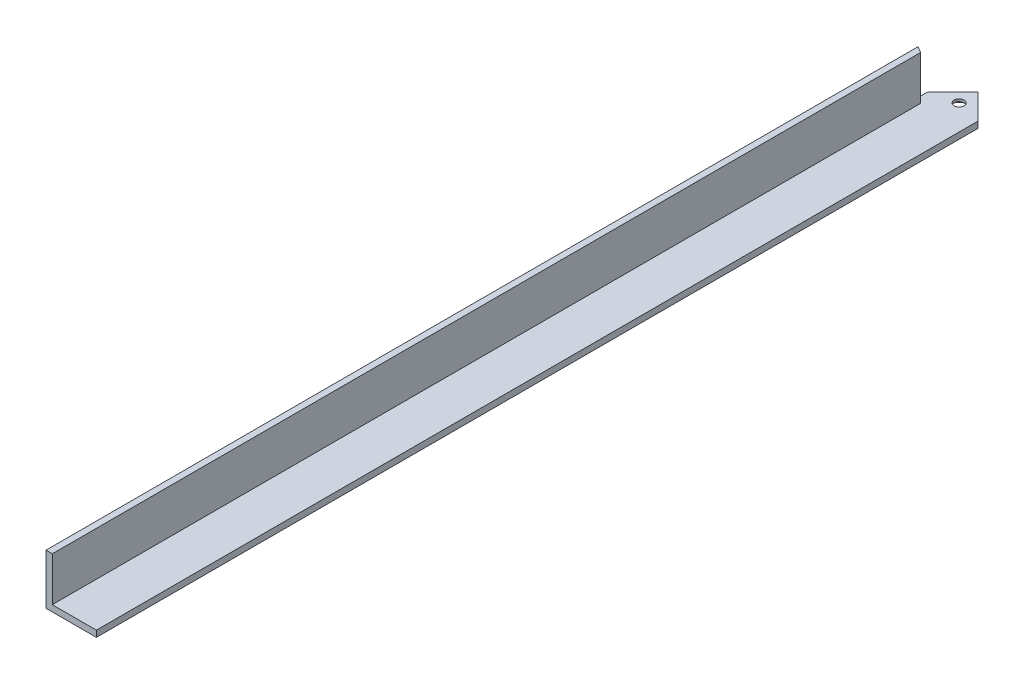
ISO-10303-21;
HEADER;
FILE_DESCRIPTION(('STEP AP214'),'2;1');
FILE_NAME('part.step','',(''),(''),'','','');
FILE_SCHEMA(('AUTOMOTIVE_DESIGN { 1 0 10303 214 1 1 1 1 }'));
ENDSEC;
DATA;
#1=APPLICATION_CONTEXT('core data for automotive mechanical design processes');
#2=APPLICATION_PROTOCOL_DEFINITION('international standard','automotive_design',2000,#1);
#3=PRODUCT_CONTEXT('',#1,'mechanical');
#4=PRODUCT('Part','Part','',(#3));
#5=PRODUCT_RELATED_PRODUCT_CATEGORY('part','',(#4));
#6=PRODUCT_DEFINITION_FORMATION('','',#4);
#7=PRODUCT_DEFINITION_CONTEXT('part definition',#1,'design');
#8=PRODUCT_DEFINITION('design','',#6,#7);
#9=PRODUCT_DEFINITION_SHAPE('','',#8);
#10=(LENGTH_UNIT() NAMED_UNIT(*) SI_UNIT(.MILLI.,.METRE.));
#11=(NAMED_UNIT(*) PLANE_ANGLE_UNIT() SI_UNIT($,.RADIAN.));
#12=(NAMED_UNIT(*) SI_UNIT($,.STERADIAN.) SOLID_ANGLE_UNIT());
#13=UNCERTAINTY_MEASURE_WITH_UNIT(LENGTH_MEASURE(1.E-05),#10,'distance_accuracy_value','');
#14=(GEOMETRIC_REPRESENTATION_CONTEXT(3) GLOBAL_UNCERTAINTY_ASSIGNED_CONTEXT((#13)) GLOBAL_UNIT_ASSIGNED_CONTEXT((#10,
#11,#12)) REPRESENTATION_CONTEXT('',''));
#15=CARTESIAN_POINT('',(0.,0.,0.));
#16=DIRECTION('',(0.,0.,1.));
#17=DIRECTION('',(1.,0.,0.));
#18=AXIS2_PLACEMENT_3D('',#15,#16,#17);
#19=CARTESIAN_POINT('',(6.35,50.8,914.4));
#20=DIRECTION('',(0.,-1.,0.));
#21=DIRECTION('',(0.,0.,-1.));
#22=AXIS2_PLACEMENT_3D('',#19,#20,#21);
#23=PLANE('',#22);
#24=CARTESIAN_POINT('',(25.4,50.8,0.));
#25=DIRECTION('',(0.,-1.,0.));
#26=DIRECTION('',(0.,0.,-1.));
#27=AXIS2_PLACEMENT_3D('',#24,#25,#26);
#28=CIRCLE('',#27,43.18);
#29=CARTESIAN_POINT('',(6.35,50.8,38.7506116080766));
#30=VERTEX_POINT('',#29);
#31=CARTESIAN_POINT('',(0.,50.8,34.9192267955635));
#32=VERTEX_POINT('',#31);
#33=EDGE_CURVE('E142',#30,#32,#28,.T.);
#34=ORIENTED_EDGE('',*,*,#33,.T.);
#35=DIRECTION('',(0.,0.,-1.));
#36=VECTOR('',#35,1.);
#37=CARTESIAN_POINT('',(0.,50.8,914.4));
#38=LINE('',#37,#36);
#39=CARTESIAN_POINT('',(0.,50.8,914.4));
#40=VERTEX_POINT('',#39);
#41=EDGE_CURVE('E45',#40,#32,#38,.T.);
#42=ORIENTED_EDGE('',*,*,#41,.F.);
#43=DIRECTION('',(-1.,0.,0.));
#44=VECTOR('',#43,1.);
#45=CARTESIAN_POINT('',(6.35,50.8,914.4));
#46=LINE('',#45,#44);
#47=CARTESIAN_POINT('',(6.35,50.8,914.4));
#48=VERTEX_POINT('',#47);
#49=EDGE_CURVE('E145',#48,#40,#46,.T.);
#50=ORIENTED_EDGE('',*,*,#49,.F.);
#51=DIRECTION('',(0.,0.,-1.));
#52=VECTOR('',#51,1.);
#53=CARTESIAN_POINT('',(6.35,50.8,914.4));
#54=LINE('',#53,#52);
#55=EDGE_CURVE('E156',#48,#30,#54,.T.);
#56=ORIENTED_EDGE('',*,*,#55,.T.);
#57=EDGE_LOOP('',(#34,#42,#50,#56));
#58=FACE_BOUND('',#57,.T.);
#59=ADVANCED_FACE('F37',(#58),#23,.F.);
#60=CARTESIAN_POINT('',(0.,50.8,914.4));
#61=DIRECTION('',(1.,0.,0.));
#62=DIRECTION('',(0.,0.,-1.));
#63=AXIS2_PLACEMENT_3D('',#60,#61,#62);
#64=PLANE('',#63);
#65=DIRECTION('',(0.,0.,-1.));
#66=VECTOR('',#65,1.);
#67=CARTESIAN_POINT('',(0.,6.35,0.));
#68=LINE('',#67,#66);
#69=CARTESIAN_POINT('',(0.,6.35,34.9192267955635));
#70=VERTEX_POINT('',#69);
#71=CARTESIAN_POINT('',(0.,6.35,25.4));
#72=VERTEX_POINT('',#71);
#73=EDGE_CURVE('E140',#70,#72,#68,.T.);
#74=ORIENTED_EDGE('',*,*,#73,.T.);
#75=DIRECTION('',(0.,-1.,0.));
#76=VECTOR('',#75,1.);
#77=CARTESIAN_POINT('',(0.,50.7999999999999,25.4000000000001));
#78=LINE('',#77,#76);
#79=CARTESIAN_POINT('',(0.,0.,25.4));
#80=VERTEX_POINT('',#79);
#81=EDGE_CURVE('E52',#72,#80,#78,.T.);
#82=ORIENTED_EDGE('',*,*,#81,.T.);
#83=DIRECTION('',(0.,0.,-1.));
#84=VECTOR('',#83,1.);
#85=CARTESIAN_POINT('',(0.,0.,914.4));
#86=LINE('',#85,#84);
#87=CARTESIAN_POINT('',(0.,0.,914.4));
#88=VERTEX_POINT('',#87);
#89=EDGE_CURVE('E168',#88,#80,#86,.T.);
#90=ORIENTED_EDGE('',*,*,#89,.F.);
#91=DIRECTION('',(0.,-1.,0.));
#92=VECTOR('',#91,1.);
#93=CARTESIAN_POINT('',(0.,50.8,914.4));
#94=LINE('',#93,#92);
#95=EDGE_CURVE('E147',#40,#88,#94,.T.);
#96=ORIENTED_EDGE('',*,*,#95,.F.);
#97=ORIENTED_EDGE('',*,*,#41,.T.);
#98=DIRECTION('',(0.,-1.,0.));
#99=VECTOR('',#98,1.);
#100=CARTESIAN_POINT('',(0.,50.801,34.9192267955635));
#101=LINE('',#100,#99);
#102=EDGE_CURVE('E134',#32,#70,#101,.T.);
#103=ORIENTED_EDGE('',*,*,#102,.T.);
#104=EDGE_LOOP('',(#74,#82,#90,#96,#97,#103));
#105=FACE_BOUND('',#104,.T.);
#106=ADVANCED_FACE('F176',(#105),#64,.F.);
#107=CARTESIAN_POINT('',(6.35,6.35,914.4));
#108=DIRECTION('',(-1.,0.,0.));
#109=DIRECTION('',(0.,0.,1.));
#110=AXIS2_PLACEMENT_3D('',#107,#108,#109);
#111=PLANE('',#110);
#112=DIRECTION('',(0.,-1.,0.));
#113=VECTOR('',#112,1.);
#114=CARTESIAN_POINT('',(6.35,50.801,38.7506116080766));
#115=LINE('',#114,#113);
#116=CARTESIAN_POINT('',(6.35,6.35,38.7506116080766));
#117=VERTEX_POINT('',#116);
#118=EDGE_CURVE('E131',#117,#30,#115,.F.);
#119=ORIENTED_EDGE('',*,*,#118,.T.);
#120=ORIENTED_EDGE('',*,*,#55,.F.);
#121=DIRECTION('',(0.,1.,0.));
#122=VECTOR('',#121,1.);
#123=CARTESIAN_POINT('',(6.35,6.35,914.4));
#124=LINE('',#123,#122);
#125=CARTESIAN_POINT('',(6.35,6.35,914.4));
#126=VERTEX_POINT('',#125);
#127=EDGE_CURVE('E59',#126,#48,#124,.T.);
#128=ORIENTED_EDGE('',*,*,#127,.F.);
#129=DIRECTION('',(0.,0.,-1.));
#130=VECTOR('',#129,1.);
#131=CARTESIAN_POINT('',(6.35,6.35,914.4));
#132=LINE('',#131,#130);
#133=EDGE_CURVE('E160',#126,#117,#132,.T.);
#134=ORIENTED_EDGE('',*,*,#133,.T.);
#135=EDGE_LOOP('',(#119,#120,#128,#134));
#136=FACE_BOUND('',#135,.T.);
#137=ADVANCED_FACE('F184',(#136),#111,.F.);
#138=CARTESIAN_POINT('',(0.,0.,914.4));
#139=DIRECTION('',(0.,1.,0.));
#140=DIRECTION('',(0.,0.,1.));
#141=AXIS2_PLACEMENT_3D('',#138,#139,#140);
#142=PLANE('',#141);
#143=CARTESIAN_POINT('',(25.4,0.,19.05));
#144=DIRECTION('',(0.,-1.,0.));
#145=DIRECTION('',(0.,0.,-1.));
#146=AXIS2_PLACEMENT_3D('',#143,#144,#145);
#147=CIRCLE('',#146,9.6774);
#148=CARTESIAN_POINT('',(25.4,0.,9.37260000000001));
#149=VERTEX_POINT('',#148);
#150=EDGE_CURVE('E237',#149,#149,#147,.T.);
#151=ORIENTED_EDGE('',*,*,#150,.F.);
#152=EDGE_LOOP('',(#151));
#153=FACE_BOUND('',#152,.T.);
#154=DIRECTION('',(0.707106781186546,0.,-0.707106781186549));
#155=VECTOR('',#154,1.);
#156=CARTESIAN_POINT('',(-444.5,0.,469.900000000002));
#157=LINE('',#156,#155);
#158=CARTESIAN_POINT('',(25.4,-4.44089209850063E-13,0.));
#159=VERTEX_POINT('',#158);
#160=EDGE_CURVE('E110',#80,#159,#157,.T.);
#161=ORIENTED_EDGE('',*,*,#160,.T.);
#162=DIRECTION('',(0.707106781186548,0.,0.707106781186547));
#163=VECTOR('',#162,1.);
#164=CARTESIAN_POINT('',(469.9,0.,444.5));
#165=LINE('',#164,#163);
#166=CARTESIAN_POINT('',(50.8,0.,25.4));
#167=VERTEX_POINT('',#166);
#168=EDGE_CURVE('E108',#159,#167,#165,.T.);
#169=ORIENTED_EDGE('',*,*,#168,.T.);
#170=DIRECTION('',(0.,0.,-1.));
#171=VECTOR('',#170,1.);
#172=CARTESIAN_POINT('',(50.8,0.,914.4));
#173=LINE('',#172,#171);
#174=CARTESIAN_POINT('',(50.8,0.,914.4));
#175=VERTEX_POINT('',#174);
#176=EDGE_CURVE('E165',#175,#167,#173,.T.);
#177=ORIENTED_EDGE('',*,*,#176,.F.);
#178=DIRECTION('',(1.,0.,0.));
#179=VECTOR('',#178,1.);
#180=CARTESIAN_POINT('',(0.,0.,914.4));
#181=LINE('',#180,#179);
#182=EDGE_CURVE('E149',#88,#175,#181,.T.);
#183=ORIENTED_EDGE('',*,*,#182,.F.);
#184=ORIENTED_EDGE('',*,*,#89,.T.);
#185=EDGE_LOOP('',(#161,#169,#177,#183,#184));
#186=FACE_BOUND('',#185,.T.);
#187=ADVANCED_FACE('F188',(#153,#186),#142,.F.);
#188=CARTESIAN_POINT('',(50.8,0.,914.4));
#189=DIRECTION('',(-1.,0.,0.));
#190=DIRECTION('',(0.,0.,1.));
#191=AXIS2_PLACEMENT_3D('',#188,#189,#190);
#192=PLANE('',#191);
#193=ORIENTED_EDGE('',*,*,#176,.T.);
#194=DIRECTION('',(0.,1.,0.));
#195=VECTOR('',#194,1.);
#196=CARTESIAN_POINT('',(50.8,0.,25.4));
#197=LINE('',#196,#195);
#198=CARTESIAN_POINT('',(50.7999999999999,6.35,25.3999999999999));
#199=VERTEX_POINT('',#198);
#200=EDGE_CURVE('E128',#167,#199,#197,.T.);
#201=ORIENTED_EDGE('',*,*,#200,.T.);
#202=DIRECTION('',(0.,0.,-1.));
#203=VECTOR('',#202,1.);
#204=CARTESIAN_POINT('',(50.8,6.35,914.4));
#205=LINE('',#204,#203);
#206=CARTESIAN_POINT('',(50.8,6.35,914.4));
#207=VERTEX_POINT('',#206);
#208=EDGE_CURVE('E119',#207,#199,#205,.T.);
#209=ORIENTED_EDGE('',*,*,#208,.F.);
#210=DIRECTION('',(0.,1.,0.));
#211=VECTOR('',#210,1.);
#212=CARTESIAN_POINT('',(50.8,0.,914.4));
#213=LINE('',#212,#211);
#214=EDGE_CURVE('E151',#175,#207,#213,.T.);
#215=ORIENTED_EDGE('',*,*,#214,.F.);
#216=EDGE_LOOP('',(#193,#201,#209,#215));
#217=FACE_BOUND('',#216,.T.);
#218=ADVANCED_FACE('F193',(#217),#192,.F.);
#219=CARTESIAN_POINT('',(50.8,6.35,914.4));
#220=DIRECTION('',(0.,-1.,0.));
#221=DIRECTION('',(0.,0.,-1.));
#222=AXIS2_PLACEMENT_3D('',#219,#220,#221);
#223=PLANE('',#222);
#224=CARTESIAN_POINT('',(25.4,6.35,19.05));
#225=DIRECTION('',(0.,-1.,0.));
#226=DIRECTION('',(0.,0.,-1.));
#227=AXIS2_PLACEMENT_3D('',#224,#225,#226);
#228=CIRCLE('',#227,5.04189999999999);
#229=CARTESIAN_POINT('',(25.4,6.35,14.0081));
#230=VERTEX_POINT('',#229);
#231=EDGE_CURVE('E40',#230,#230,#228,.T.);
#232=ORIENTED_EDGE('',*,*,#231,.T.);
#233=EDGE_LOOP('',(#232));
#234=FACE_BOUND('',#233,.T.);
#235=ORIENTED_EDGE('',*,*,#208,.T.);
#236=DIRECTION('',(0.707106781186548,0.,0.707106781186547));
#237=VECTOR('',#236,1.);
#238=CARTESIAN_POINT('',(25.4,6.35,0.));
#239=LINE('',#238,#237);
#240=CARTESIAN_POINT('',(25.4,6.35,0.));
#241=VERTEX_POINT('',#240);
#242=EDGE_CURVE('E105',#241,#199,#239,.T.);
#243=ORIENTED_EDGE('',*,*,#242,.F.);
#244=DIRECTION('',(-0.707106781186546,0.,0.707106781186549));
#245=VECTOR('',#244,1.);
#246=CARTESIAN_POINT('',(-419.1,6.35,444.500000000002));
#247=LINE('',#246,#245);
#248=EDGE_CURVE('E11',#241,#72,#247,.T.);
#249=ORIENTED_EDGE('',*,*,#248,.T.);
#250=ORIENTED_EDGE('',*,*,#73,.F.);
#251=CARTESIAN_POINT('',(25.4,6.35,0.));
#252=DIRECTION('',(0.,1.,0.));
#253=DIRECTION('',(-1.,0.,0.));
#254=AXIS2_PLACEMENT_3D('',#251,#252,#253);
#255=CIRCLE('',#254,43.18);
#256=EDGE_CURVE('E137',#70,#117,#255,.T.);
#257=ORIENTED_EDGE('',*,*,#256,.T.);
#258=ORIENTED_EDGE('',*,*,#133,.F.);
#259=DIRECTION('',(-1.,0.,0.));
#260=VECTOR('',#259,1.);
#261=CARTESIAN_POINT('',(50.8,6.35,914.4));
#262=LINE('',#261,#260);
#263=EDGE_CURVE('E153',#207,#126,#262,.T.);
#264=ORIENTED_EDGE('',*,*,#263,.F.);
#265=EDGE_LOOP('',(#235,#243,#249,#250,#257,#258,#264));
#266=FACE_BOUND('',#265,.T.);
#267=ADVANCED_FACE('F116',(#234,#266),#223,.F.);
#268=CARTESIAN_POINT('',(0.,0.,914.4));
#269=DIRECTION('',(0.,0.,1.));
#270=DIRECTION('',(1.,0.,0.));
#271=AXIS2_PLACEMENT_3D('',#268,#269,#270);
#272=PLANE('',#271);
#273=ORIENTED_EDGE('',*,*,#49,.T.);
#274=ORIENTED_EDGE('',*,*,#95,.T.);
#275=ORIENTED_EDGE('',*,*,#182,.T.);
#276=ORIENTED_EDGE('',*,*,#214,.T.);
#277=ORIENTED_EDGE('',*,*,#263,.T.);
#278=ORIENTED_EDGE('',*,*,#127,.T.);
#279=EDGE_LOOP('',(#273,#274,#275,#276,#277,#278));
#280=FACE_BOUND('',#279,.T.);
#281=ADVANCED_FACE('F191',(#280),#272,.T.);
#282=CARTESIAN_POINT('',(25.4,50.801,0.));
#283=DIRECTION('',(0.,-1.,0.));
#284=DIRECTION('',(1.,0.,0.));
#285=AXIS2_PLACEMENT_3D('',#282,#283,#284);
#286=CYLINDRICAL_SURFACE('',#285,43.18);
#287=ORIENTED_EDGE('',*,*,#33,.F.);
#288=ORIENTED_EDGE('',*,*,#118,.F.);
#289=ORIENTED_EDGE('',*,*,#256,.F.);
#290=ORIENTED_EDGE('',*,*,#102,.F.);
#291=EDGE_LOOP('',(#287,#288,#289,#290));
#292=FACE_BOUND('',#291,.T.);
#293=ADVANCED_FACE('F181',(#292),#286,.F.);
#294=CARTESIAN_POINT('',(25.4000000000001,-1212.85,0.));
#295=DIRECTION('',(-0.707106781186547,0.,0.707106781186548));
#296=DIRECTION('',(0.707106781186548,0.,0.707106781186547));
#297=AXIS2_PLACEMENT_3D('',#294,#295,#296);
#298=PLANE('',#297);
#299=DIRECTION('',(0.,1.,0.));
#300=VECTOR('',#299,1.);
#301=CARTESIAN_POINT('',(25.4000000000001,-1212.85,0.));
#302=LINE('',#301,#300);
#303=EDGE_CURVE('E102',#159,#241,#302,.T.);
#304=ORIENTED_EDGE('',*,*,#303,.T.);
#305=ORIENTED_EDGE('',*,*,#242,.T.);
#306=ORIENTED_EDGE('',*,*,#200,.F.);
#307=ORIENTED_EDGE('',*,*,#168,.F.);
#308=EDGE_LOOP('',(#304,#305,#306,#307));
#309=FACE_BOUND('',#308,.T.);
#310=ADVANCED_FACE('F103',(#309),#298,.F.);
#311=CARTESIAN_POINT('',(25.4000000000001,-1212.85,0.));
#312=DIRECTION('',(0.707106781186549,0.,0.707106781186546));
#313=DIRECTION('',(0.707106781186546,0.,-0.707106781186549));
#314=AXIS2_PLACEMENT_3D('',#311,#312,#313);
#315=PLANE('',#314);
#316=ORIENTED_EDGE('',*,*,#248,.F.);
#317=ORIENTED_EDGE('',*,*,#303,.F.);
#318=ORIENTED_EDGE('',*,*,#160,.F.);
#319=ORIENTED_EDGE('',*,*,#81,.F.);
#320=EDGE_LOOP('',(#316,#317,#318,#319));
#321=FACE_BOUND('',#320,.T.);
#322=ADVANCED_FACE('F112',(#321),#315,.F.);
#323=CARTESIAN_POINT('',(25.4,0.,19.05));
#324=DIRECTION('',(0.,-1.,0.));
#325=DIRECTION('',(0.,0.,-1.));
#326=AXIS2_PLACEMENT_3D('',#323,#324,#325);
#327=CYLINDRICAL_SURFACE('',#326,5.04189999999999);
#328=CARTESIAN_POINT('',(25.4,3.88964634032228,19.05));
#329=DIRECTION('',(0.,-1.,0.));
#330=DIRECTION('',(0.,0.,-1.));
#331=AXIS2_PLACEMENT_3D('',#328,#329,#330);
#332=CIRCLE('',#331,5.0419);
#333=CARTESIAN_POINT('',(25.4,3.88964634032228,14.0081));
#334=VERTEX_POINT('',#333);
#335=EDGE_CURVE('E122',#334,#334,#332,.T.);
#336=ORIENTED_EDGE('',*,*,#335,.T.);
#337=EDGE_LOOP('',(#336));
#338=FACE_BOUND('',#337,.T.);
#339=ORIENTED_EDGE('',*,*,#231,.F.);
#340=EDGE_LOOP('',(#339));
#341=FACE_BOUND('',#340,.T.);
#342=ADVANCED_FACE('F223',(#338,#341),#327,.F.);
#343=CARTESIAN_POINT('',(25.4,0.,19.05));
#344=DIRECTION('',(0.,-1.,0.));
#345=DIRECTION('',(0.,0.,-1.));
#346=AXIS2_PLACEMENT_3D('',#343,#344,#345);
#347=CONICAL_SURFACE('',#346,9.6774,0.872664625997165);
#348=ORIENTED_EDGE('',*,*,#335,.F.);
#349=EDGE_LOOP('',(#348));
#350=FACE_BOUND('',#349,.T.);
#351=ORIENTED_EDGE('',*,*,#150,.T.);
#352=EDGE_LOOP('',(#351));
#353=FACE_BOUND('',#352,.T.);
#354=ADVANCED_FACE('F226',(#350,#353),#347,.F.);
#355=CLOSED_SHELL('',(#59,#106,#137,#187,#218,#267,#281,#293,#310,#322,#342,#354));
#356=MANIFOLD_SOLID_BREP('B2',#355);
#357=ADVANCED_BREP_SHAPE_REPRESENTATION('',(#18,#356),#14);
#358=SHAPE_DEFINITION_REPRESENTATION(#9,#357);
ENDSEC;
END-ISO-10303-21;
